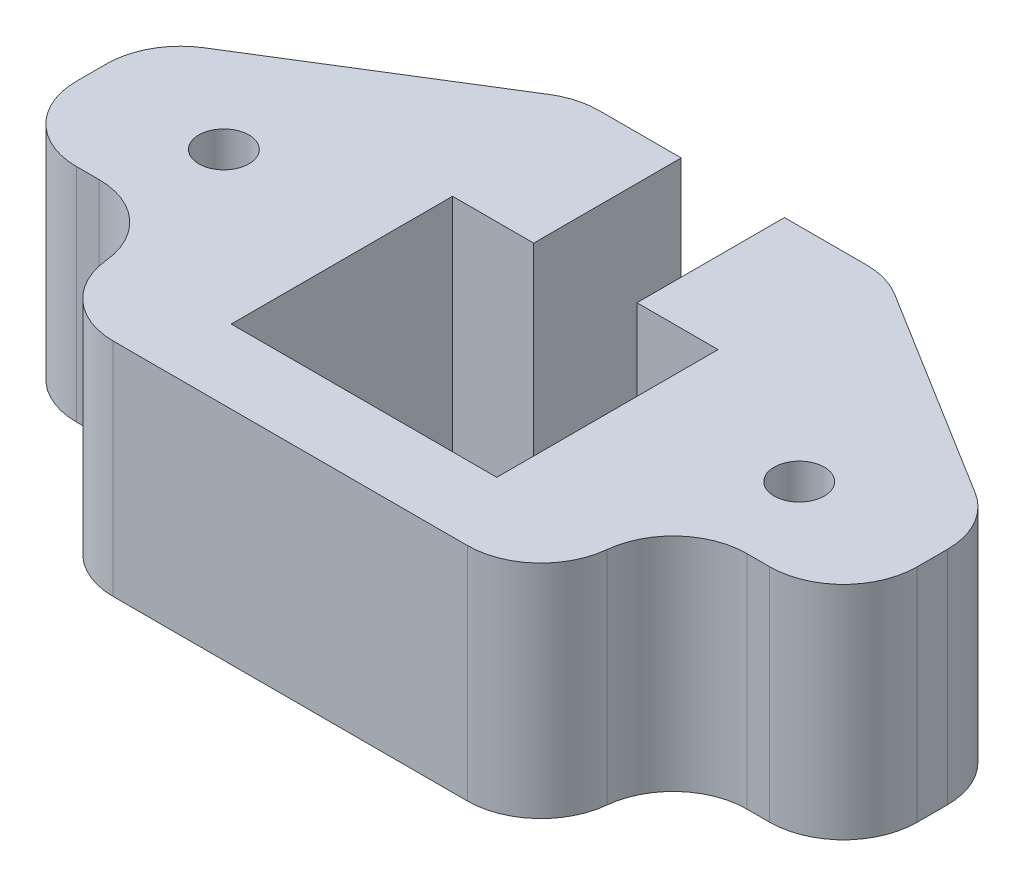
ISO-10303-21;
HEADER;
FILE_DESCRIPTION(('STEP AP214'),'2;1');
FILE_NAME('part.step','',(''),(''),'','','');
FILE_SCHEMA(('AUTOMOTIVE_DESIGN { 1 0 10303 214 1 1 1 1 }'));
ENDSEC;
DATA;
#1=APPLICATION_CONTEXT('core data for automotive mechanical design processes');
#2=APPLICATION_PROTOCOL_DEFINITION('international standard','automotive_design',2000,#1);
#3=PRODUCT_CONTEXT('',#1,'mechanical');
#4=PRODUCT('Part','Part','',(#3));
#5=PRODUCT_RELATED_PRODUCT_CATEGORY('part','',(#4));
#6=PRODUCT_DEFINITION_FORMATION('','',#4);
#7=PRODUCT_DEFINITION_CONTEXT('part definition',#1,'design');
#8=PRODUCT_DEFINITION('design','',#6,#7);
#9=PRODUCT_DEFINITION_SHAPE('','',#8);
#10=(LENGTH_UNIT() NAMED_UNIT(*) SI_UNIT(.MILLI.,.METRE.));
#11=(NAMED_UNIT(*) PLANE_ANGLE_UNIT() SI_UNIT($,.RADIAN.));
#12=(NAMED_UNIT(*) SI_UNIT($,.STERADIAN.) SOLID_ANGLE_UNIT());
#13=UNCERTAINTY_MEASURE_WITH_UNIT(LENGTH_MEASURE(1.E-05),#10,'distance_accuracy_value','');
#14=(GEOMETRIC_REPRESENTATION_CONTEXT(3) GLOBAL_UNCERTAINTY_ASSIGNED_CONTEXT((#13)) GLOBAL_UNIT_ASSIGNED_CONTEXT((#10,
#11,#12)) REPRESENTATION_CONTEXT('',''));
#15=CARTESIAN_POINT('',(0.,0.,0.));
#16=DIRECTION('',(0.,0.,1.));
#17=DIRECTION('',(1.,0.,0.));
#18=AXIS2_PLACEMENT_3D('',#15,#16,#17);
#19=CARTESIAN_POINT('',(0.,15.,0.));
#20=DIRECTION('',(0.,1.,0.));
#21=DIRECTION('',(0.,0.,1.));
#22=AXIS2_PLACEMENT_3D('',#19,#20,#21);
#23=PLANE('',#22);
#24=CARTESIAN_POINT('',(40.5,15.,25.));
#25=DIRECTION('',(0.,1.,0.));
#26=DIRECTION('',(0.,0.,1.));
#27=AXIS2_PLACEMENT_3D('',#24,#25,#26);
#28=CIRCLE('',#27,5.);
#29=CARTESIAN_POINT('',(40.5,15.,30.));
#30=VERTEX_POINT('',#29);
#31=CARTESIAN_POINT('',(45.4749371855331,15.,25.5));
#32=VERTEX_POINT('',#31);
#33=EDGE_CURVE('E337',#30,#32,#28,.T.);
#34=ORIENTED_EDGE('',*,*,#33,.T.);
#35=CARTESIAN_POINT('',(50.4498743710662,15.,26.));
#36=DIRECTION('',(0.,1.,0.));
#37=DIRECTION('',(0.,0.,1.));
#38=AXIS2_PLACEMENT_3D('',#35,#36,#37);
#39=CIRCLE('',#38,5.);
#40=CARTESIAN_POINT('',(50.4498743710662,15.,21.));
#41=VERTEX_POINT('',#40);
#42=EDGE_CURVE('E378',#32,#41,#39,.F.);
#43=ORIENTED_EDGE('',*,*,#42,.T.);
#44=DIRECTION('',(1.,0.,0.));
#45=VECTOR('',#44,1.);
#46=CARTESIAN_POINT('',(57.,15.,21.));
#47=LINE('',#46,#45);
#48=CARTESIAN_POINT('',(52.,15.,21.));
#49=VERTEX_POINT('',#48);
#50=EDGE_CURVE('E381',#41,#49,#47,.T.);
#51=ORIENTED_EDGE('',*,*,#50,.T.);
#52=CARTESIAN_POINT('',(52.,15.,16.));
#53=DIRECTION('',(0.,1.,0.));
#54=DIRECTION('',(0.,0.,1.));
#55=AXIS2_PLACEMENT_3D('',#52,#53,#54);
#56=CIRCLE('',#55,5.);
#57=CARTESIAN_POINT('',(57.,15.,16.));
#58=VERTEX_POINT('',#57);
#59=EDGE_CURVE('E339',#49,#58,#56,.T.);
#60=ORIENTED_EDGE('',*,*,#59,.T.);
#61=DIRECTION('',(0.,0.,-1.));
#62=VECTOR('',#61,1.);
#63=CARTESIAN_POINT('',(57.,15.,21.));
#64=LINE('',#63,#62);
#65=CARTESIAN_POINT('',(57.,15.,13.9514940011683));
#66=VERTEX_POINT('',#65);
#67=EDGE_CURVE('E219',#58,#66,#64,.T.);
#68=ORIENTED_EDGE('',*,*,#67,.T.);
#69=CARTESIAN_POINT('',(52.,15.,13.9514940011683));
#70=DIRECTION('',(0.,1.,0.));
#71=DIRECTION('',(0.,0.,1.));
#72=AXIS2_PLACEMENT_3D('',#69,#70,#71);
#73=CIRCLE('',#72,5.);
#74=CARTESIAN_POINT('',(54.6363600946334,15.,9.70301127772164));
#75=VERTEX_POINT('',#74);
#76=EDGE_CURVE('E329',#66,#75,#73,.T.);
#77=ORIENTED_EDGE('',*,*,#76,.T.);
#78=DIRECTION('',(0.849696544689335,0.,0.527272018926669));
#79=VECTOR('',#78,1.);
#80=CARTESIAN_POINT('',(39.,15.,0.));
#81=LINE('',#80,#79);
#82=CARTESIAN_POINT('',(40.2110667933064,15.,0.751517276553329));
#83=VERTEX_POINT('',#82);
#84=EDGE_CURVE('E432',#83,#75,#81,.T.);
#85=ORIENTED_EDGE('',*,*,#84,.F.);
#86=CARTESIAN_POINT('',(37.574706698673,15.,5.));
#87=DIRECTION('',(0.,1.,0.));
#88=DIRECTION('',(0.,0.,1.));
#89=AXIS2_PLACEMENT_3D('',#86,#87,#88);
#90=CIRCLE('',#89,5.);
#91=CARTESIAN_POINT('',(37.574706698673,15.,0.));
#92=VERTEX_POINT('',#91);
#93=EDGE_CURVE('E215',#83,#92,#90,.T.);
#94=ORIENTED_EDGE('',*,*,#93,.T.);
#95=DIRECTION('',(-1.,0.,0.));
#96=VECTOR('',#95,1.);
#97=CARTESIAN_POINT('',(57.,15.,0.));
#98=LINE('',#97,#96);
#99=CARTESIAN_POINT('',(32.,15.,0.));
#100=VERTEX_POINT('',#99);
#101=EDGE_CURVE('E206',#92,#100,#98,.T.);
#102=ORIENTED_EDGE('',*,*,#101,.T.);
#103=DIRECTION('',(0.,0.,1.));
#104=VECTOR('',#103,1.);
#105=CARTESIAN_POINT('',(32.,15.,0.));
#106=LINE('',#105,#104);
#107=CARTESIAN_POINT('',(32.,15.,10.));
#108=VERTEX_POINT('',#107);
#109=EDGE_CURVE('E211',#100,#108,#106,.T.);
#110=ORIENTED_EDGE('',*,*,#109,.T.);
#111=DIRECTION('',(1.,0.,0.));
#112=VECTOR('',#111,1.);
#113=CARTESIAN_POINT('',(32.,15.,10.));
#114=LINE('',#113,#112);
#115=CARTESIAN_POINT('',(37.5,15.,10.));
#116=VERTEX_POINT('',#115);
#117=EDGE_CURVE('E234',#108,#116,#114,.T.);
#118=ORIENTED_EDGE('',*,*,#117,.T.);
#119=DIRECTION('',(0.,0.,1.));
#120=VECTOR('',#119,1.);
#121=CARTESIAN_POINT('',(37.5,15.,10.));
#122=LINE('',#121,#120);
#123=CARTESIAN_POINT('',(37.5,15.,25.));
#124=VERTEX_POINT('',#123);
#125=EDGE_CURVE('E236',#116,#124,#122,.T.);
#126=ORIENTED_EDGE('',*,*,#125,.T.);
#127=DIRECTION('',(-1.,0.,0.));
#128=VECTOR('',#127,1.);
#129=CARTESIAN_POINT('',(37.5,15.,25.));
#130=LINE('',#129,#128);
#131=CARTESIAN_POINT('',(19.5,15.,25.));
#132=VERTEX_POINT('',#131);
#133=EDGE_CURVE('E241',#124,#132,#130,.T.);
#134=ORIENTED_EDGE('',*,*,#133,.T.);
#135=DIRECTION('',(0.,0.,-1.));
#136=VECTOR('',#135,1.);
#137=CARTESIAN_POINT('',(19.5,15.,25.));
#138=LINE('',#137,#136);
#139=CARTESIAN_POINT('',(19.5,15.,10.));
#140=VERTEX_POINT('',#139);
#141=EDGE_CURVE('E243',#132,#140,#138,.T.);
#142=ORIENTED_EDGE('',*,*,#141,.T.);
#143=DIRECTION('',(1.,0.,0.));
#144=VECTOR('',#143,1.);
#145=CARTESIAN_POINT('',(19.5,15.,10.));
#146=LINE('',#145,#144);
#147=CARTESIAN_POINT('',(25.,15.,10.));
#148=VERTEX_POINT('',#147);
#149=EDGE_CURVE('E245',#140,#148,#146,.T.);
#150=ORIENTED_EDGE('',*,*,#149,.T.);
#151=DIRECTION('',(0.,0.,-1.));
#152=VECTOR('',#151,1.);
#153=CARTESIAN_POINT('',(25.,15.,10.));
#154=LINE('',#153,#152);
#155=CARTESIAN_POINT('',(25.,15.,0.));
#156=VERTEX_POINT('',#155);
#157=EDGE_CURVE('E247',#148,#156,#154,.T.);
#158=ORIENTED_EDGE('',*,*,#157,.T.);
#159=DIRECTION('',(-1.,0.,0.));
#160=VECTOR('',#159,1.);
#161=CARTESIAN_POINT('',(25.,15.,0.));
#162=LINE('',#161,#160);
#163=CARTESIAN_POINT('',(19.425293301327,15.,0.));
#164=VERTEX_POINT('',#163);
#165=EDGE_CURVE('E282',#156,#164,#162,.T.);
#166=ORIENTED_EDGE('',*,*,#165,.T.);
#167=CARTESIAN_POINT('',(19.425293301327,15.,5.));
#168=DIRECTION('',(0.,1.,0.));
#169=DIRECTION('',(0.,0.,1.));
#170=AXIS2_PLACEMENT_3D('',#167,#168,#169);
#171=CIRCLE('',#170,5.);
#172=CARTESIAN_POINT('',(16.7889332066936,15.,0.751517276553327));
#173=VERTEX_POINT('',#172);
#174=EDGE_CURVE('E326',#164,#173,#171,.T.);
#175=ORIENTED_EDGE('',*,*,#174,.T.);
#176=DIRECTION('',(0.849696544689335,0.,-0.527272018926669));
#177=VECTOR('',#176,1.);
#178=CARTESIAN_POINT('',(18.,15.,0.));
#179=LINE('',#178,#177);
#180=CARTESIAN_POINT('',(2.36363990536666,15.,9.70301127772164));
#181=VERTEX_POINT('',#180);
#182=EDGE_CURVE('E434',#181,#173,#179,.T.);
#183=ORIENTED_EDGE('',*,*,#182,.F.);
#184=CARTESIAN_POINT('',(5.,15.,13.9514940011683));
#185=DIRECTION('',(0.,1.,0.));
#186=DIRECTION('',(0.,0.,1.));
#187=AXIS2_PLACEMENT_3D('',#184,#185,#186);
#188=CIRCLE('',#187,5.);
#189=CARTESIAN_POINT('',(0.,15.,13.9514940011683));
#190=VERTEX_POINT('',#189);
#191=EDGE_CURVE('E331',#181,#190,#188,.T.);
#192=ORIENTED_EDGE('',*,*,#191,.T.);
#193=DIRECTION('',(0.,0.,1.));
#194=VECTOR('',#193,1.);
#195=CARTESIAN_POINT('',(0.,15.,0.));
#196=LINE('',#195,#194);
#197=CARTESIAN_POINT('',(0.,15.,16.));
#198=VERTEX_POINT('',#197);
#199=EDGE_CURVE('E410',#190,#198,#196,.T.);
#200=ORIENTED_EDGE('',*,*,#199,.T.);
#201=CARTESIAN_POINT('',(5.,15.,16.));
#202=DIRECTION('',(0.,1.,0.));
#203=DIRECTION('',(0.,0.,1.));
#204=AXIS2_PLACEMENT_3D('',#201,#202,#203);
#205=CIRCLE('',#204,5.);
#206=CARTESIAN_POINT('',(5.,15.,21.));
#207=VERTEX_POINT('',#206);
#208=EDGE_CURVE('E333',#198,#207,#205,.T.);
#209=ORIENTED_EDGE('',*,*,#208,.T.);
#210=DIRECTION('',(1.,0.,0.));
#211=VECTOR('',#210,1.);
#212=CARTESIAN_POINT('',(0.,15.,21.));
#213=LINE('',#212,#211);
#214=CARTESIAN_POINT('',(6.55012562893382,15.,21.));
#215=VERTEX_POINT('',#214);
#216=EDGE_CURVE('E408',#207,#215,#213,.T.);
#217=ORIENTED_EDGE('',*,*,#216,.T.);
#218=CARTESIAN_POINT('',(6.55012562893381,15.,26.));
#219=DIRECTION('',(0.,1.,0.));
#220=DIRECTION('',(0.,0.,1.));
#221=AXIS2_PLACEMENT_3D('',#218,#219,#220);
#222=CIRCLE('',#221,5.);
#223=CARTESIAN_POINT('',(11.5250628144669,15.,25.5));
#224=VERTEX_POINT('',#223);
#225=EDGE_CURVE('E11',#215,#224,#222,.F.);
#226=ORIENTED_EDGE('',*,*,#225,.T.);
#227=CARTESIAN_POINT('',(16.5,15.,25.));
#228=DIRECTION('',(0.,1.,0.));
#229=DIRECTION('',(0.,0.,1.));
#230=AXIS2_PLACEMENT_3D('',#227,#228,#229);
#231=CIRCLE('',#230,5.);
#232=CARTESIAN_POINT('',(16.5,15.,30.));
#233=VERTEX_POINT('',#232);
#234=EDGE_CURVE('E335',#224,#233,#231,.T.);
#235=ORIENTED_EDGE('',*,*,#234,.T.);
#236=DIRECTION('',(1.,0.,0.));
#237=VECTOR('',#236,1.);
#238=CARTESIAN_POINT('',(11.5,15.,30.));
#239=LINE('',#238,#237);
#240=EDGE_CURVE('E392',#233,#30,#239,.T.);
#241=ORIENTED_EDGE('',*,*,#240,.T.);
#242=EDGE_LOOP('',(#34,#43,#51,#60,#68,#77,#85,#94,#102,#110,#118,#126,#134,#142,#150,#158,#166,
#175,#183,#192,#200,#209,#217,#226,#235,#241));
#243=FACE_BOUND('',#242,.T.);
#244=CARTESIAN_POINT('',(9.,15.,15.));
#245=DIRECTION('',(0.,1.,0.));
#246=DIRECTION('',(0.,0.,1.));
#247=AXIS2_PLACEMENT_3D('',#244,#245,#246);
#248=CIRCLE('',#247,1.7);
#249=CARTESIAN_POINT('',(9.,15.,16.7));
#250=VERTEX_POINT('',#249);
#251=EDGE_CURVE('E254',#250,#250,#248,.T.);
#252=ORIENTED_EDGE('',*,*,#251,.F.);
#253=EDGE_LOOP('',(#252));
#254=FACE_BOUND('',#253,.T.);
#255=CARTESIAN_POINT('',(48.,15.,15.));
#256=DIRECTION('',(0.,1.,0.));
#257=DIRECTION('',(0.,0.,1.));
#258=AXIS2_PLACEMENT_3D('',#255,#256,#257);
#259=CIRCLE('',#258,1.7);
#260=CARTESIAN_POINT('',(48.,15.,16.7));
#261=VERTEX_POINT('',#260);
#262=EDGE_CURVE('E443',#261,#261,#259,.T.);
#263=ORIENTED_EDGE('',*,*,#262,.F.);
#264=EDGE_LOOP('',(#263));
#265=FACE_BOUND('',#264,.T.);
#266=ADVANCED_FACE('F34',(#243,#254,#265),#23,.T.);
#267=CARTESIAN_POINT('',(0.,0.,0.));
#268=DIRECTION('',(0.,1.,0.));
#269=DIRECTION('',(0.,0.,1.));
#270=AXIS2_PLACEMENT_3D('',#267,#268,#269);
#271=PLANE('',#270);
#272=DIRECTION('',(0.,0.,-1.));
#273=VECTOR('',#272,1.);
#274=CARTESIAN_POINT('',(57.,0.,21.));
#275=LINE('',#274,#273);
#276=CARTESIAN_POINT('',(57.,0.,16.));
#277=VERTEX_POINT('',#276);
#278=CARTESIAN_POINT('',(57.,0.,13.9514940011683));
#279=VERTEX_POINT('',#278);
#280=EDGE_CURVE('E264',#277,#279,#275,.T.);
#281=ORIENTED_EDGE('',*,*,#280,.F.);
#282=CARTESIAN_POINT('',(52.,0.,16.));
#283=DIRECTION('',(0.,1.,0.));
#284=DIRECTION('',(0.,0.,1.));
#285=AXIS2_PLACEMENT_3D('',#282,#283,#284);
#286=CIRCLE('',#285,5.);
#287=CARTESIAN_POINT('',(52.,0.,21.));
#288=VERTEX_POINT('',#287);
#289=EDGE_CURVE('E320',#277,#288,#286,.F.);
#290=ORIENTED_EDGE('',*,*,#289,.T.);
#291=DIRECTION('',(1.,0.,0.));
#292=VECTOR('',#291,1.);
#293=CARTESIAN_POINT('',(57.,0.,21.));
#294=LINE('',#293,#292);
#295=CARTESIAN_POINT('',(50.4498743710662,0.,21.));
#296=VERTEX_POINT('',#295);
#297=EDGE_CURVE('E262',#296,#288,#294,.T.);
#298=ORIENTED_EDGE('',*,*,#297,.F.);
#299=CARTESIAN_POINT('',(50.4498743710662,0.,26.));
#300=DIRECTION('',(0.,1.,0.));
#301=DIRECTION('',(0.,0.,1.));
#302=AXIS2_PLACEMENT_3D('',#299,#300,#301);
#303=CIRCLE('',#302,5.);
#304=CARTESIAN_POINT('',(45.4749371855331,0.,25.5));
#305=VERTEX_POINT('',#304);
#306=EDGE_CURVE('E376',#296,#305,#303,.T.);
#307=ORIENTED_EDGE('',*,*,#306,.T.);
#308=CARTESIAN_POINT('',(40.5,0.,25.));
#309=DIRECTION('',(0.,1.,0.));
#310=DIRECTION('',(0.,0.,1.));
#311=AXIS2_PLACEMENT_3D('',#308,#309,#310);
#312=CIRCLE('',#311,5.);
#313=CARTESIAN_POINT('',(40.5,0.,30.));
#314=VERTEX_POINT('',#313);
#315=EDGE_CURVE('E318',#305,#314,#312,.F.);
#316=ORIENTED_EDGE('',*,*,#315,.T.);
#317=DIRECTION('',(1.,0.,0.));
#318=VECTOR('',#317,1.);
#319=CARTESIAN_POINT('',(11.5,0.,30.));
#320=LINE('',#319,#318);
#321=CARTESIAN_POINT('',(16.5,0.,30.));
#322=VERTEX_POINT('',#321);
#323=EDGE_CURVE('E259',#322,#314,#320,.T.);
#324=ORIENTED_EDGE('',*,*,#323,.F.);
#325=CARTESIAN_POINT('',(16.5,0.,25.));
#326=DIRECTION('',(0.,1.,0.));
#327=DIRECTION('',(0.,0.,1.));
#328=AXIS2_PLACEMENT_3D('',#325,#326,#327);
#329=CIRCLE('',#328,5.);
#330=CARTESIAN_POINT('',(11.5250628144669,0.,25.5));
#331=VERTEX_POINT('',#330);
#332=EDGE_CURVE('E316',#322,#331,#329,.F.);
#333=ORIENTED_EDGE('',*,*,#332,.T.);
#334=CARTESIAN_POINT('',(6.55012562893381,0.,26.));
#335=DIRECTION('',(0.,1.,0.));
#336=DIRECTION('',(0.,0.,1.));
#337=AXIS2_PLACEMENT_3D('',#334,#335,#336);
#338=CIRCLE('',#337,5.);
#339=CARTESIAN_POINT('',(6.55012562893382,0.,21.));
#340=VERTEX_POINT('',#339);
#341=EDGE_CURVE('E42',#331,#340,#338,.T.);
#342=ORIENTED_EDGE('',*,*,#341,.T.);
#343=DIRECTION('',(1.,0.,0.));
#344=VECTOR('',#343,1.);
#345=CARTESIAN_POINT('',(0.,0.,21.));
#346=LINE('',#345,#344);
#347=CARTESIAN_POINT('',(5.,0.,21.));
#348=VERTEX_POINT('',#347);
#349=EDGE_CURVE('E257',#348,#340,#346,.T.);
#350=ORIENTED_EDGE('',*,*,#349,.F.);
#351=CARTESIAN_POINT('',(5.,0.,16.));
#352=DIRECTION('',(0.,1.,0.));
#353=DIRECTION('',(0.,0.,1.));
#354=AXIS2_PLACEMENT_3D('',#351,#352,#353);
#355=CIRCLE('',#354,5.);
#356=CARTESIAN_POINT('',(0.,0.,16.));
#357=VERTEX_POINT('',#356);
#358=EDGE_CURVE('E314',#348,#357,#355,.F.);
#359=ORIENTED_EDGE('',*,*,#358,.T.);
#360=DIRECTION('',(0.,0.,1.));
#361=VECTOR('',#360,1.);
#362=CARTESIAN_POINT('',(0.,0.,0.));
#363=LINE('',#362,#361);
#364=CARTESIAN_POINT('',(0.,0.,13.9514940011683));
#365=VERTEX_POINT('',#364);
#366=EDGE_CURVE('E253',#365,#357,#363,.T.);
#367=ORIENTED_EDGE('',*,*,#366,.F.);
#368=CARTESIAN_POINT('',(5.,0.,13.9514940011683));
#369=DIRECTION('',(0.,1.,0.));
#370=DIRECTION('',(0.,0.,1.));
#371=AXIS2_PLACEMENT_3D('',#368,#369,#370);
#372=CIRCLE('',#371,5.);
#373=CARTESIAN_POINT('',(2.36363990536666,0.,9.70301127772164));
#374=VERTEX_POINT('',#373);
#375=EDGE_CURVE('E312',#365,#374,#372,.F.);
#376=ORIENTED_EDGE('',*,*,#375,.T.);
#377=DIRECTION('',(0.849696544689335,0.,-0.527272018926669));
#378=VECTOR('',#377,1.);
#379=CARTESIAN_POINT('',(5.0042840749741,0.,8.06438182668048));
#380=LINE('',#379,#378);
#381=CARTESIAN_POINT('',(16.7889332066936,0.,0.751517276553326));
#382=VERTEX_POINT('',#381);
#383=EDGE_CURVE('E433',#374,#382,#380,.T.);
#384=ORIENTED_EDGE('',*,*,#383,.T.);
#385=CARTESIAN_POINT('',(19.425293301327,0.,5.));
#386=DIRECTION('',(0.,1.,0.));
#387=DIRECTION('',(0.,0.,1.));
#388=AXIS2_PLACEMENT_3D('',#385,#386,#387);
#389=CIRCLE('',#388,5.);
#390=CARTESIAN_POINT('',(19.425293301327,0.,0.));
#391=VERTEX_POINT('',#390);
#392=EDGE_CURVE('E306',#382,#391,#389,.F.);
#393=ORIENTED_EDGE('',*,*,#392,.T.);
#394=DIRECTION('',(-1.,0.,0.));
#395=VECTOR('',#394,1.);
#396=CARTESIAN_POINT('',(25.,0.,0.));
#397=LINE('',#396,#395);
#398=CARTESIAN_POINT('',(25.,0.,0.));
#399=VERTEX_POINT('',#398);
#400=EDGE_CURVE('E250',#399,#391,#397,.T.);
#401=ORIENTED_EDGE('',*,*,#400,.F.);
#402=DIRECTION('',(0.,0.,-1.));
#403=VECTOR('',#402,1.);
#404=CARTESIAN_POINT('',(25.,0.,10.));
#405=LINE('',#404,#403);
#406=CARTESIAN_POINT('',(25.,0.,10.));
#407=VERTEX_POINT('',#406);
#408=EDGE_CURVE('E280',#407,#399,#405,.T.);
#409=ORIENTED_EDGE('',*,*,#408,.F.);
#410=DIRECTION('',(1.,0.,0.));
#411=VECTOR('',#410,1.);
#412=CARTESIAN_POINT('',(19.5,0.,10.));
#413=LINE('',#412,#411);
#414=CARTESIAN_POINT('',(19.5,0.,10.));
#415=VERTEX_POINT('',#414);
#416=EDGE_CURVE('E278',#415,#407,#413,.T.);
#417=ORIENTED_EDGE('',*,*,#416,.F.);
#418=DIRECTION('',(0.,0.,-1.));
#419=VECTOR('',#418,1.);
#420=CARTESIAN_POINT('',(19.5,0.,25.));
#421=LINE('',#420,#419);
#422=CARTESIAN_POINT('',(19.5,0.,25.));
#423=VERTEX_POINT('',#422);
#424=EDGE_CURVE('E276',#423,#415,#421,.T.);
#425=ORIENTED_EDGE('',*,*,#424,.F.);
#426=DIRECTION('',(-1.,0.,0.));
#427=VECTOR('',#426,1.);
#428=CARTESIAN_POINT('',(37.5,0.,25.));
#429=LINE('',#428,#427);
#430=CARTESIAN_POINT('',(37.5,0.,25.));
#431=VERTEX_POINT('',#430);
#432=EDGE_CURVE('E274',#431,#423,#429,.T.);
#433=ORIENTED_EDGE('',*,*,#432,.F.);
#434=DIRECTION('',(0.,0.,1.));
#435=VECTOR('',#434,1.);
#436=CARTESIAN_POINT('',(37.5,0.,10.));
#437=LINE('',#436,#435);
#438=CARTESIAN_POINT('',(37.5,0.,10.));
#439=VERTEX_POINT('',#438);
#440=EDGE_CURVE('E272',#439,#431,#437,.T.);
#441=ORIENTED_EDGE('',*,*,#440,.F.);
#442=DIRECTION('',(1.,0.,0.));
#443=VECTOR('',#442,1.);
#444=CARTESIAN_POINT('',(32.,0.,10.));
#445=LINE('',#444,#443);
#446=CARTESIAN_POINT('',(32.,0.,10.));
#447=VERTEX_POINT('',#446);
#448=EDGE_CURVE('E270',#447,#439,#445,.T.);
#449=ORIENTED_EDGE('',*,*,#448,.F.);
#450=DIRECTION('',(0.,0.,1.));
#451=VECTOR('',#450,1.);
#452=CARTESIAN_POINT('',(32.,0.,0.));
#453=LINE('',#452,#451);
#454=CARTESIAN_POINT('',(32.,0.,0.));
#455=VERTEX_POINT('',#454);
#456=EDGE_CURVE('E268',#455,#447,#453,.T.);
#457=ORIENTED_EDGE('',*,*,#456,.F.);
#458=DIRECTION('',(-1.,0.,0.));
#459=VECTOR('',#458,1.);
#460=CARTESIAN_POINT('',(57.,0.,0.));
#461=LINE('',#460,#459);
#462=CARTESIAN_POINT('',(37.574706698673,0.,0.));
#463=VERTEX_POINT('',#462);
#464=EDGE_CURVE('E225',#463,#455,#461,.T.);
#465=ORIENTED_EDGE('',*,*,#464,.F.);
#466=CARTESIAN_POINT('',(37.574706698673,0.,5.));
#467=DIRECTION('',(0.,1.,0.));
#468=DIRECTION('',(0.,0.,1.));
#469=AXIS2_PLACEMENT_3D('',#466,#467,#468);
#470=CIRCLE('',#469,5.);
#471=CARTESIAN_POINT('',(40.2110667933064,0.,0.751517276553336));
#472=VERTEX_POINT('',#471);
#473=EDGE_CURVE('E308',#463,#472,#470,.F.);
#474=ORIENTED_EDGE('',*,*,#473,.T.);
#475=DIRECTION('',(0.849696544689335,0.,0.527272018926669));
#476=VECTOR('',#475,1.);
#477=CARTESIAN_POINT('',(10.8426154957772,0.,-17.472827291141));
#478=LINE('',#477,#476);
#479=CARTESIAN_POINT('',(54.6363600946334,0.,9.70301127772165));
#480=VERTEX_POINT('',#479);
#481=EDGE_CURVE('E430',#472,#480,#478,.T.);
#482=ORIENTED_EDGE('',*,*,#481,.T.);
#483=CARTESIAN_POINT('',(52.,0.,13.9514940011683));
#484=DIRECTION('',(0.,1.,0.));
#485=DIRECTION('',(0.,0.,1.));
#486=AXIS2_PLACEMENT_3D('',#483,#484,#485);
#487=CIRCLE('',#486,5.);
#488=EDGE_CURVE('E310',#480,#279,#487,.F.);
#489=ORIENTED_EDGE('',*,*,#488,.T.);
#490=EDGE_LOOP('',(#281,#290,#298,#307,#316,#324,#333,#342,#350,#359,#367,#376,#384,#393,#401,
#409,#417,#425,#433,#441,#449,#457,#465,#474,#482,#489));
#491=FACE_BOUND('',#490,.T.);
#492=CARTESIAN_POINT('',(9.,0.,15.));
#493=DIRECTION('',(0.,1.,0.));
#494=DIRECTION('',(0.,0.,1.));
#495=AXIS2_PLACEMENT_3D('',#492,#493,#494);
#496=CIRCLE('',#495,1.7);
#497=CARTESIAN_POINT('',(9.,0.,16.7));
#498=VERTEX_POINT('',#497);
#499=EDGE_CURVE('E446',#498,#498,#496,.T.);
#500=ORIENTED_EDGE('',*,*,#499,.T.);
#501=EDGE_LOOP('',(#500));
#502=FACE_BOUND('',#501,.T.);
#503=CARTESIAN_POINT('',(48.,0.,15.));
#504=DIRECTION('',(0.,1.,0.));
#505=DIRECTION('',(0.,0.,1.));
#506=AXIS2_PLACEMENT_3D('',#503,#504,#505);
#507=CIRCLE('',#506,1.7);
#508=CARTESIAN_POINT('',(48.,0.,16.7));
#509=VERTEX_POINT('',#508);
#510=EDGE_CURVE('E437',#509,#509,#507,.T.);
#511=ORIENTED_EDGE('',*,*,#510,.T.);
#512=EDGE_LOOP('',(#511));
#513=FACE_BOUND('',#512,.T.);
#514=ADVANCED_FACE('F397',(#491,#502,#513),#271,.F.);
#515=CARTESIAN_POINT('',(25.,15.,0.));
#516=DIRECTION('',(0.,0.,1.));
#517=DIRECTION('',(1.,0.,0.));
#518=AXIS2_PLACEMENT_3D('',#515,#516,#517);
#519=PLANE('',#518);
#520=ORIENTED_EDGE('',*,*,#400,.T.);
#521=DIRECTION('',(0.,1.,0.));
#522=VECTOR('',#521,1.);
#523=CARTESIAN_POINT('',(19.425293301327,15.,0.));
#524=LINE('',#523,#522);
#525=EDGE_CURVE('E364',#391,#164,#524,.T.);
#526=ORIENTED_EDGE('',*,*,#525,.T.);
#527=ORIENTED_EDGE('',*,*,#165,.F.);
#528=DIRECTION('',(0.,-1.,0.));
#529=VECTOR('',#528,1.);
#530=CARTESIAN_POINT('',(25.,15.,0.));
#531=LINE('',#530,#529);
#532=EDGE_CURVE('E249',#156,#399,#531,.T.);
#533=ORIENTED_EDGE('',*,*,#532,.T.);
#534=EDGE_LOOP('',(#520,#526,#527,#533));
#535=FACE_BOUND('',#534,.T.);
#536=ADVANCED_FACE('F482',(#535),#519,.F.);
#537=CARTESIAN_POINT('',(0.,15.,0.));
#538=DIRECTION('',(1.,0.,0.));
#539=DIRECTION('',(0.,0.,-1.));
#540=AXIS2_PLACEMENT_3D('',#537,#538,#539);
#541=PLANE('',#540);
#542=ORIENTED_EDGE('',*,*,#366,.T.);
#543=DIRECTION('',(0.,-1.,0.));
#544=VECTOR('',#543,1.);
#545=CARTESIAN_POINT('',(0.,15.,16.));
#546=LINE('',#545,#544);
#547=EDGE_CURVE('E352',#357,#198,#546,.F.);
#548=ORIENTED_EDGE('',*,*,#547,.T.);
#549=ORIENTED_EDGE('',*,*,#199,.F.);
#550=DIRECTION('',(0.,-1.,0.));
#551=VECTOR('',#550,1.);
#552=CARTESIAN_POINT('',(0.,15.,13.9514940011683));
#553=LINE('',#552,#551);
#554=EDGE_CURVE('E349',#190,#365,#553,.T.);
#555=ORIENTED_EDGE('',*,*,#554,.T.);
#556=EDGE_LOOP('',(#542,#548,#549,#555));
#557=FACE_BOUND('',#556,.T.);
#558=ADVANCED_FACE('F467',(#557),#541,.F.);
#559=CARTESIAN_POINT('',(0.,15.,21.));
#560=DIRECTION('',(0.,0.,-1.));
#561=DIRECTION('',(-1.,0.,0.));
#562=AXIS2_PLACEMENT_3D('',#559,#560,#561);
#563=PLANE('',#562);
#564=ORIENTED_EDGE('',*,*,#349,.T.);
#565=DIRECTION('',(0.,-1.,0.));
#566=VECTOR('',#565,1.);
#567=CARTESIAN_POINT('',(6.55012562893382,15.,21.));
#568=LINE('',#567,#566);
#569=EDGE_CURVE('E55',#340,#215,#568,.F.);
#570=ORIENTED_EDGE('',*,*,#569,.T.);
#571=ORIENTED_EDGE('',*,*,#216,.F.);
#572=DIRECTION('',(0.,-1.,0.));
#573=VECTOR('',#572,1.);
#574=CARTESIAN_POINT('',(5.,15.,21.));
#575=LINE('',#574,#573);
#576=EDGE_CURVE('E346',#207,#348,#575,.T.);
#577=ORIENTED_EDGE('',*,*,#576,.T.);
#578=EDGE_LOOP('',(#564,#570,#571,#577));
#579=FACE_BOUND('',#578,.T.);
#580=ADVANCED_FACE('F465',(#579),#563,.F.);
#581=CARTESIAN_POINT('',(11.5,15.,30.));
#582=DIRECTION('',(0.,0.,-1.));
#583=DIRECTION('',(-1.,0.,0.));
#584=AXIS2_PLACEMENT_3D('',#581,#582,#583);
#585=PLANE('',#584);
#586=ORIENTED_EDGE('',*,*,#323,.T.);
#587=DIRECTION('',(0.,-1.,0.));
#588=VECTOR('',#587,1.);
#589=CARTESIAN_POINT('',(40.5,15.,30.));
#590=LINE('',#589,#588);
#591=EDGE_CURVE('E344',#314,#30,#590,.F.);
#592=ORIENTED_EDGE('',*,*,#591,.T.);
#593=ORIENTED_EDGE('',*,*,#240,.F.);
#594=DIRECTION('',(0.,-1.,0.));
#595=VECTOR('',#594,1.);
#596=CARTESIAN_POINT('',(16.5,15.,30.));
#597=LINE('',#596,#595);
#598=EDGE_CURVE('E341',#233,#322,#597,.T.);
#599=ORIENTED_EDGE('',*,*,#598,.T.);
#600=EDGE_LOOP('',(#586,#592,#593,#599));
#601=FACE_BOUND('',#600,.T.);
#602=ADVANCED_FACE('F405',(#601),#585,.F.);
#603=CARTESIAN_POINT('',(57.,15.,21.));
#604=DIRECTION('',(0.,0.,-1.));
#605=DIRECTION('',(-1.,0.,0.));
#606=AXIS2_PLACEMENT_3D('',#603,#604,#605);
#607=PLANE('',#606);
#608=ORIENTED_EDGE('',*,*,#50,.F.);
#609=DIRECTION('',(0.,-1.,0.));
#610=VECTOR('',#609,1.);
#611=CARTESIAN_POINT('',(50.4498743710662,15.,21.));
#612=LINE('',#611,#610);
#613=EDGE_CURVE('E367',#41,#296,#612,.T.);
#614=ORIENTED_EDGE('',*,*,#613,.T.);
#615=ORIENTED_EDGE('',*,*,#297,.T.);
#616=DIRECTION('',(0.,-1.,0.));
#617=VECTOR('',#616,1.);
#618=CARTESIAN_POINT('',(52.,15.,21.));
#619=LINE('',#618,#617);
#620=EDGE_CURVE('E323',#288,#49,#619,.F.);
#621=ORIENTED_EDGE('',*,*,#620,.T.);
#622=EDGE_LOOP('',(#608,#614,#615,#621));
#623=FACE_BOUND('',#622,.T.);
#624=ADVANCED_FACE('F388',(#623),#607,.F.);
#625=CARTESIAN_POINT('',(57.,15.,21.));
#626=DIRECTION('',(-1.,0.,0.));
#627=DIRECTION('',(0.,0.,1.));
#628=AXIS2_PLACEMENT_3D('',#625,#626,#627);
#629=PLANE('',#628);
#630=ORIENTED_EDGE('',*,*,#67,.F.);
#631=DIRECTION('',(0.,-1.,0.));
#632=VECTOR('',#631,1.);
#633=CARTESIAN_POINT('',(57.,15.,16.));
#634=LINE('',#633,#632);
#635=EDGE_CURVE('E303',#58,#277,#634,.T.);
#636=ORIENTED_EDGE('',*,*,#635,.T.);
#637=ORIENTED_EDGE('',*,*,#280,.T.);
#638=DIRECTION('',(0.,1.,0.));
#639=VECTOR('',#638,1.);
#640=CARTESIAN_POINT('',(57.,15.,13.9514940011683));
#641=LINE('',#640,#639);
#642=EDGE_CURVE('E228',#279,#66,#641,.T.);
#643=ORIENTED_EDGE('',*,*,#642,.T.);
#644=EDGE_LOOP('',(#630,#636,#637,#643));
#645=FACE_BOUND('',#644,.T.);
#646=ADVANCED_FACE('F418',(#645),#629,.F.);
#647=CARTESIAN_POINT('',(57.,15.,0.));
#648=DIRECTION('',(0.,0.,1.));
#649=DIRECTION('',(1.,0.,0.));
#650=AXIS2_PLACEMENT_3D('',#647,#648,#649);
#651=PLANE('',#650);
#652=ORIENTED_EDGE('',*,*,#101,.F.);
#653=DIRECTION('',(0.,-1.,0.));
#654=VECTOR('',#653,1.);
#655=CARTESIAN_POINT('',(37.574706698673,15.,0.));
#656=LINE('',#655,#654);
#657=EDGE_CURVE('E362',#92,#463,#656,.T.);
#658=ORIENTED_EDGE('',*,*,#657,.T.);
#659=ORIENTED_EDGE('',*,*,#464,.T.);
#660=DIRECTION('',(0.,-1.,0.));
#661=VECTOR('',#660,1.);
#662=CARTESIAN_POINT('',(32.,15.,0.));
#663=LINE('',#662,#661);
#664=EDGE_CURVE('E222',#100,#455,#663,.T.);
#665=ORIENTED_EDGE('',*,*,#664,.F.);
#666=EDGE_LOOP('',(#652,#658,#659,#665));
#667=FACE_BOUND('',#666,.T.);
#668=ADVANCED_FACE('F223',(#667),#651,.F.);
#669=CARTESIAN_POINT('',(32.,15.,0.));
#670=DIRECTION('',(1.,0.,0.));
#671=DIRECTION('',(0.,0.,-1.));
#672=AXIS2_PLACEMENT_3D('',#669,#670,#671);
#673=PLANE('',#672);
#674=ORIENTED_EDGE('',*,*,#456,.T.);
#675=DIRECTION('',(0.,-1.,0.));
#676=VECTOR('',#675,1.);
#677=CARTESIAN_POINT('',(32.,15.,10.));
#678=LINE('',#677,#676);
#679=EDGE_CURVE('E229',#108,#447,#678,.T.);
#680=ORIENTED_EDGE('',*,*,#679,.F.);
#681=ORIENTED_EDGE('',*,*,#109,.F.);
#682=ORIENTED_EDGE('',*,*,#664,.T.);
#683=EDGE_LOOP('',(#674,#680,#681,#682));
#684=FACE_BOUND('',#683,.T.);
#685=ADVANCED_FACE('F231',(#684),#673,.F.);
#686=CARTESIAN_POINT('',(32.,15.,10.));
#687=DIRECTION('',(0.,0.,-1.));
#688=DIRECTION('',(-1.,0.,0.));
#689=AXIS2_PLACEMENT_3D('',#686,#687,#688);
#690=PLANE('',#689);
#691=ORIENTED_EDGE('',*,*,#448,.T.);
#692=DIRECTION('',(0.,-1.,0.));
#693=VECTOR('',#692,1.);
#694=CARTESIAN_POINT('',(37.5,15.,10.));
#695=LINE('',#694,#693);
#696=EDGE_CURVE('E297',#116,#439,#695,.T.);
#697=ORIENTED_EDGE('',*,*,#696,.F.);
#698=ORIENTED_EDGE('',*,*,#117,.F.);
#699=ORIENTED_EDGE('',*,*,#679,.T.);
#700=EDGE_LOOP('',(#691,#697,#698,#699));
#701=FACE_BOUND('',#700,.T.);
#702=ADVANCED_FACE('F511',(#701),#690,.F.);
#703=CARTESIAN_POINT('',(37.5,15.,10.));
#704=DIRECTION('',(1.,0.,0.));
#705=DIRECTION('',(0.,0.,-1.));
#706=AXIS2_PLACEMENT_3D('',#703,#704,#705);
#707=PLANE('',#706);
#708=ORIENTED_EDGE('',*,*,#440,.T.);
#709=DIRECTION('',(0.,-1.,0.));
#710=VECTOR('',#709,1.);
#711=CARTESIAN_POINT('',(37.5,15.,25.));
#712=LINE('',#711,#710);
#713=EDGE_CURVE('E294',#124,#431,#712,.T.);
#714=ORIENTED_EDGE('',*,*,#713,.F.);
#715=ORIENTED_EDGE('',*,*,#125,.F.);
#716=ORIENTED_EDGE('',*,*,#696,.T.);
#717=EDGE_LOOP('',(#708,#714,#715,#716));
#718=FACE_BOUND('',#717,.T.);
#719=ADVANCED_FACE('F507',(#718),#707,.F.);
#720=CARTESIAN_POINT('',(37.5,15.,25.));
#721=DIRECTION('',(0.,0.,1.));
#722=DIRECTION('',(1.,0.,0.));
#723=AXIS2_PLACEMENT_3D('',#720,#721,#722);
#724=PLANE('',#723);
#725=ORIENTED_EDGE('',*,*,#432,.T.);
#726=DIRECTION('',(0.,-1.,0.));
#727=VECTOR('',#726,1.);
#728=CARTESIAN_POINT('',(19.5,15.,25.));
#729=LINE('',#728,#727);
#730=EDGE_CURVE('E291',#132,#423,#729,.T.);
#731=ORIENTED_EDGE('',*,*,#730,.F.);
#732=ORIENTED_EDGE('',*,*,#133,.F.);
#733=ORIENTED_EDGE('',*,*,#713,.T.);
#734=EDGE_LOOP('',(#725,#731,#732,#733));
#735=FACE_BOUND('',#734,.T.);
#736=ADVANCED_FACE('F502',(#735),#724,.F.);
#737=CARTESIAN_POINT('',(19.5,15.,25.));
#738=DIRECTION('',(-1.,0.,0.));
#739=DIRECTION('',(0.,0.,1.));
#740=AXIS2_PLACEMENT_3D('',#737,#738,#739);
#741=PLANE('',#740);
#742=ORIENTED_EDGE('',*,*,#424,.T.);
#743=DIRECTION('',(0.,-1.,0.));
#744=VECTOR('',#743,1.);
#745=CARTESIAN_POINT('',(19.5,15.,10.));
#746=LINE('',#745,#744);
#747=EDGE_CURVE('E288',#140,#415,#746,.T.);
#748=ORIENTED_EDGE('',*,*,#747,.F.);
#749=ORIENTED_EDGE('',*,*,#141,.F.);
#750=ORIENTED_EDGE('',*,*,#730,.T.);
#751=EDGE_LOOP('',(#742,#748,#749,#750));
#752=FACE_BOUND('',#751,.T.);
#753=ADVANCED_FACE('F498',(#752),#741,.F.);
#754=CARTESIAN_POINT('',(19.5,15.,10.));
#755=DIRECTION('',(0.,0.,-1.));
#756=DIRECTION('',(-1.,0.,0.));
#757=AXIS2_PLACEMENT_3D('',#754,#755,#756);
#758=PLANE('',#757);
#759=ORIENTED_EDGE('',*,*,#416,.T.);
#760=DIRECTION('',(0.,-1.,0.));
#761=VECTOR('',#760,1.);
#762=CARTESIAN_POINT('',(25.,15.,10.));
#763=LINE('',#762,#761);
#764=EDGE_CURVE('E285',#148,#407,#763,.T.);
#765=ORIENTED_EDGE('',*,*,#764,.F.);
#766=ORIENTED_EDGE('',*,*,#149,.F.);
#767=ORIENTED_EDGE('',*,*,#747,.T.);
#768=EDGE_LOOP('',(#759,#765,#766,#767));
#769=FACE_BOUND('',#768,.T.);
#770=ADVANCED_FACE('F493',(#769),#758,.F.);
#771=CARTESIAN_POINT('',(25.,15.,10.));
#772=DIRECTION('',(-1.,0.,0.));
#773=DIRECTION('',(0.,0.,1.));
#774=AXIS2_PLACEMENT_3D('',#771,#772,#773);
#775=PLANE('',#774);
#776=ORIENTED_EDGE('',*,*,#408,.T.);
#777=ORIENTED_EDGE('',*,*,#532,.F.);
#778=ORIENTED_EDGE('',*,*,#157,.F.);
#779=ORIENTED_EDGE('',*,*,#764,.T.);
#780=EDGE_LOOP('',(#776,#777,#778,#779));
#781=FACE_BOUND('',#780,.T.);
#782=ADVANCED_FACE('F487',(#781),#775,.F.);
#783=CARTESIAN_POINT('',(9.,15.,15.));
#784=DIRECTION('',(0.,-1.,0.));
#785=DIRECTION('',(0.,0.,-1.));
#786=AXIS2_PLACEMENT_3D('',#783,#784,#785);
#787=CYLINDRICAL_SURFACE('',#786,1.7);
#788=ORIENTED_EDGE('',*,*,#251,.T.);
#789=EDGE_LOOP('',(#788));
#790=FACE_BOUND('',#789,.T.);
#791=ORIENTED_EDGE('',*,*,#499,.F.);
#792=EDGE_LOOP('',(#791));
#793=FACE_BOUND('',#792,.T.);
#794=ADVANCED_FACE('F527',(#790,#793),#787,.F.);
#795=CARTESIAN_POINT('',(48.,15.,15.));
#796=DIRECTION('',(0.,-1.,0.));
#797=DIRECTION('',(0.,0.,-1.));
#798=AXIS2_PLACEMENT_3D('',#795,#796,#797);
#799=CYLINDRICAL_SURFACE('',#798,1.7);
#800=ORIENTED_EDGE('',*,*,#262,.T.);
#801=EDGE_LOOP('',(#800));
#802=FACE_BOUND('',#801,.T.);
#803=ORIENTED_EDGE('',*,*,#510,.F.);
#804=EDGE_LOOP('',(#803));
#805=FACE_BOUND('',#804,.T.);
#806=ADVANCED_FACE('F559',(#802,#805),#799,.F.);
#807=CARTESIAN_POINT('',(39.,-4.,0.));
#808=DIRECTION('',(-0.527272018926669,0.,0.849696544689335));
#809=DIRECTION('',(0.849696544689335,0.,0.527272018926669));
#810=AXIS2_PLACEMENT_3D('',#807,#808,#809);
#811=PLANE('',#810);
#812=ORIENTED_EDGE('',*,*,#84,.T.);
#813=DIRECTION('',(0.,1.,0.));
#814=VECTOR('',#813,1.);
#815=CARTESIAN_POINT('',(54.6363600946334,-4.,9.70301127772164));
#816=LINE('',#815,#814);
#817=EDGE_CURVE('E360',#75,#480,#816,.F.);
#818=ORIENTED_EDGE('',*,*,#817,.T.);
#819=ORIENTED_EDGE('',*,*,#481,.F.);
#820=DIRECTION('',(0.,-1.,0.));
#821=VECTOR('',#820,1.);
#822=CARTESIAN_POINT('',(40.2110667933064,-4.,0.75151727655333));
#823=LINE('',#822,#821);
#824=EDGE_CURVE('E358',#472,#83,#823,.F.);
#825=ORIENTED_EDGE('',*,*,#824,.T.);
#826=EDGE_LOOP('',(#812,#818,#819,#825));
#827=FACE_BOUND('',#826,.T.);
#828=ADVANCED_FACE('F429',(#827),#811,.F.);
#829=CARTESIAN_POINT('',(18.,-4.,0.));
#830=DIRECTION('',(0.527272018926669,0.,0.849696544689335));
#831=DIRECTION('',(0.849696544689335,0.,-0.527272018926669));
#832=AXIS2_PLACEMENT_3D('',#829,#830,#831);
#833=PLANE('',#832);
#834=ORIENTED_EDGE('',*,*,#383,.F.);
#835=DIRECTION('',(0.,-1.,0.));
#836=VECTOR('',#835,1.);
#837=CARTESIAN_POINT('',(2.36363990536666,-4.,9.70301127772164));
#838=LINE('',#837,#836);
#839=EDGE_CURVE('E356',#374,#181,#838,.F.);
#840=ORIENTED_EDGE('',*,*,#839,.T.);
#841=ORIENTED_EDGE('',*,*,#182,.T.);
#842=DIRECTION('',(0.,1.,0.));
#843=VECTOR('',#842,1.);
#844=CARTESIAN_POINT('',(16.7889332066936,-4.,0.751517276553328));
#845=LINE('',#844,#843);
#846=EDGE_CURVE('E354',#173,#382,#845,.F.);
#847=ORIENTED_EDGE('',*,*,#846,.T.);
#848=EDGE_LOOP('',(#834,#840,#841,#847));
#849=FACE_BOUND('',#848,.T.);
#850=ADVANCED_FACE('F474',(#849),#833,.F.);
#851=CARTESIAN_POINT('',(52.,15.,16.));
#852=DIRECTION('',(0.,-1.,0.));
#853=DIRECTION('',(0.,0.,-1.));
#854=AXIS2_PLACEMENT_3D('',#851,#852,#853);
#855=CYLINDRICAL_SURFACE('',#854,5.);
#856=ORIENTED_EDGE('',*,*,#59,.F.);
#857=ORIENTED_EDGE('',*,*,#620,.F.);
#858=ORIENTED_EDGE('',*,*,#289,.F.);
#859=ORIENTED_EDGE('',*,*,#635,.F.);
#860=EDGE_LOOP('',(#856,#857,#858,#859));
#861=FACE_BOUND('',#860,.T.);
#862=ADVANCED_FACE('F421',(#861),#855,.T.);
#863=CARTESIAN_POINT('',(40.5,15.,25.));
#864=DIRECTION('',(0.,-1.,0.));
#865=DIRECTION('',(0.,0.,-1.));
#866=AXIS2_PLACEMENT_3D('',#863,#864,#865);
#867=CYLINDRICAL_SURFACE('',#866,5.);
#868=ORIENTED_EDGE('',*,*,#315,.F.);
#869=DIRECTION('',(0.,-1.,0.));
#870=VECTOR('',#869,1.);
#871=CARTESIAN_POINT('',(45.4749371855331,15.,25.5));
#872=LINE('',#871,#870);
#873=EDGE_CURVE('E370',#305,#32,#872,.F.);
#874=ORIENTED_EDGE('',*,*,#873,.T.);
#875=ORIENTED_EDGE('',*,*,#33,.F.);
#876=ORIENTED_EDGE('',*,*,#591,.F.);
#877=EDGE_LOOP('',(#868,#874,#875,#876));
#878=FACE_BOUND('',#877,.T.);
#879=ADVANCED_FACE('F402',(#878),#867,.T.);
#880=CARTESIAN_POINT('',(16.5,15.,25.));
#881=DIRECTION('',(0.,-1.,0.));
#882=DIRECTION('',(0.,0.,-1.));
#883=AXIS2_PLACEMENT_3D('',#880,#881,#882);
#884=CYLINDRICAL_SURFACE('',#883,5.);
#885=ORIENTED_EDGE('',*,*,#234,.F.);
#886=DIRECTION('',(0.,-1.,0.));
#887=VECTOR('',#886,1.);
#888=CARTESIAN_POINT('',(11.5250628144669,15.,25.5));
#889=LINE('',#888,#887);
#890=EDGE_CURVE('E372',#224,#331,#889,.T.);
#891=ORIENTED_EDGE('',*,*,#890,.T.);
#892=ORIENTED_EDGE('',*,*,#332,.F.);
#893=ORIENTED_EDGE('',*,*,#598,.F.);
#894=EDGE_LOOP('',(#885,#891,#892,#893));
#895=FACE_BOUND('',#894,.T.);
#896=ADVANCED_FACE('F593',(#895),#884,.T.);
#897=CARTESIAN_POINT('',(5.,15.,16.));
#898=DIRECTION('',(0.,-1.,0.));
#899=DIRECTION('',(0.,0.,-1.));
#900=AXIS2_PLACEMENT_3D('',#897,#898,#899);
#901=CYLINDRICAL_SURFACE('',#900,5.);
#902=ORIENTED_EDGE('',*,*,#208,.F.);
#903=ORIENTED_EDGE('',*,*,#547,.F.);
#904=ORIENTED_EDGE('',*,*,#358,.F.);
#905=ORIENTED_EDGE('',*,*,#576,.F.);
#906=EDGE_LOOP('',(#902,#903,#904,#905));
#907=FACE_BOUND('',#906,.T.);
#908=ADVANCED_FACE('F464',(#907),#901,.T.);
#909=CARTESIAN_POINT('',(5.,15.,13.9514940011683));
#910=DIRECTION('',(0.,-1.,0.));
#911=DIRECTION('',(0.,0.,-1.));
#912=AXIS2_PLACEMENT_3D('',#909,#910,#911);
#913=CYLINDRICAL_SURFACE('',#912,5.);
#914=ORIENTED_EDGE('',*,*,#191,.F.);
#915=ORIENTED_EDGE('',*,*,#839,.F.);
#916=ORIENTED_EDGE('',*,*,#375,.F.);
#917=ORIENTED_EDGE('',*,*,#554,.F.);
#918=EDGE_LOOP('',(#914,#915,#916,#917));
#919=FACE_BOUND('',#918,.T.);
#920=ADVANCED_FACE('F469',(#919),#913,.T.);
#921=CARTESIAN_POINT('',(52.,15.,13.9514940011683));
#922=DIRECTION('',(0.,1.,0.));
#923=DIRECTION('',(0.,0.,1.));
#924=AXIS2_PLACEMENT_3D('',#921,#922,#923);
#925=CYLINDRICAL_SURFACE('',#924,5.);
#926=ORIENTED_EDGE('',*,*,#488,.F.);
#927=ORIENTED_EDGE('',*,*,#817,.F.);
#928=ORIENTED_EDGE('',*,*,#76,.F.);
#929=ORIENTED_EDGE('',*,*,#642,.F.);
#930=EDGE_LOOP('',(#926,#927,#928,#929));
#931=FACE_BOUND('',#930,.T.);
#932=ADVANCED_FACE('F425',(#931),#925,.T.);
#933=CARTESIAN_POINT('',(37.574706698673,15.,5.));
#934=DIRECTION('',(0.,-1.,0.));
#935=DIRECTION('',(0.,0.,-1.));
#936=AXIS2_PLACEMENT_3D('',#933,#934,#935);
#937=CYLINDRICAL_SURFACE('',#936,5.);
#938=ORIENTED_EDGE('',*,*,#93,.F.);
#939=ORIENTED_EDGE('',*,*,#824,.F.);
#940=ORIENTED_EDGE('',*,*,#473,.F.);
#941=ORIENTED_EDGE('',*,*,#657,.F.);
#942=EDGE_LOOP('',(#938,#939,#940,#941));
#943=FACE_BOUND('',#942,.T.);
#944=ADVANCED_FACE('F620',(#943),#937,.T.);
#945=CARTESIAN_POINT('',(19.425293301327,15.,5.));
#946=DIRECTION('',(0.,1.,0.));
#947=DIRECTION('',(0.,0.,1.));
#948=AXIS2_PLACEMENT_3D('',#945,#946,#947);
#949=CYLINDRICAL_SURFACE('',#948,5.);
#950=ORIENTED_EDGE('',*,*,#392,.F.);
#951=ORIENTED_EDGE('',*,*,#846,.F.);
#952=ORIENTED_EDGE('',*,*,#174,.F.);
#953=ORIENTED_EDGE('',*,*,#525,.F.);
#954=EDGE_LOOP('',(#950,#951,#952,#953));
#955=FACE_BOUND('',#954,.T.);
#956=ADVANCED_FACE('F477',(#955),#949,.T.);
#957=CARTESIAN_POINT('',(50.4498743710662,15.,26.));
#958=DIRECTION('',(0.,-1.,0.));
#959=DIRECTION('',(0.,0.,-1.));
#960=AXIS2_PLACEMENT_3D('',#957,#958,#959);
#961=CYLINDRICAL_SURFACE('',#960,5.);
#962=ORIENTED_EDGE('',*,*,#42,.F.);
#963=ORIENTED_EDGE('',*,*,#873,.F.);
#964=ORIENTED_EDGE('',*,*,#306,.F.);
#965=ORIENTED_EDGE('',*,*,#613,.F.);
#966=EDGE_LOOP('',(#962,#963,#964,#965));
#967=FACE_BOUND('',#966,.T.);
#968=ADVANCED_FACE('F394',(#967),#961,.F.);
#969=CARTESIAN_POINT('',(6.55012562893381,15.,26.));
#970=DIRECTION('',(0.,-1.,0.));
#971=DIRECTION('',(0.,0.,-1.));
#972=AXIS2_PLACEMENT_3D('',#969,#970,#971);
#973=CYLINDRICAL_SURFACE('',#972,5.);
#974=ORIENTED_EDGE('',*,*,#225,.F.);
#975=ORIENTED_EDGE('',*,*,#569,.F.);
#976=ORIENTED_EDGE('',*,*,#341,.F.);
#977=ORIENTED_EDGE('',*,*,#890,.F.);
#978=EDGE_LOOP('',(#974,#975,#976,#977));
#979=FACE_BOUND('',#978,.T.);
#980=ADVANCED_FACE('F36',(#979),#973,.F.);
#981=CLOSED_SHELL('',(#266,#514,#536,#558,#580,#602,#624,#646,#668,#685,#702,#719,#736,#753,
#770,#782,#794,#806,#828,#850,#862,#879,#896,#908,#920,#932,#944,#956,#968,#980));
#982=MANIFOLD_SOLID_BREP('B2',#981);
#983=ADVANCED_BREP_SHAPE_REPRESENTATION('',(#18,#982),#14);
#984=SHAPE_DEFINITION_REPRESENTATION(#9,#983);
ENDSEC;
END-ISO-10303-21;
